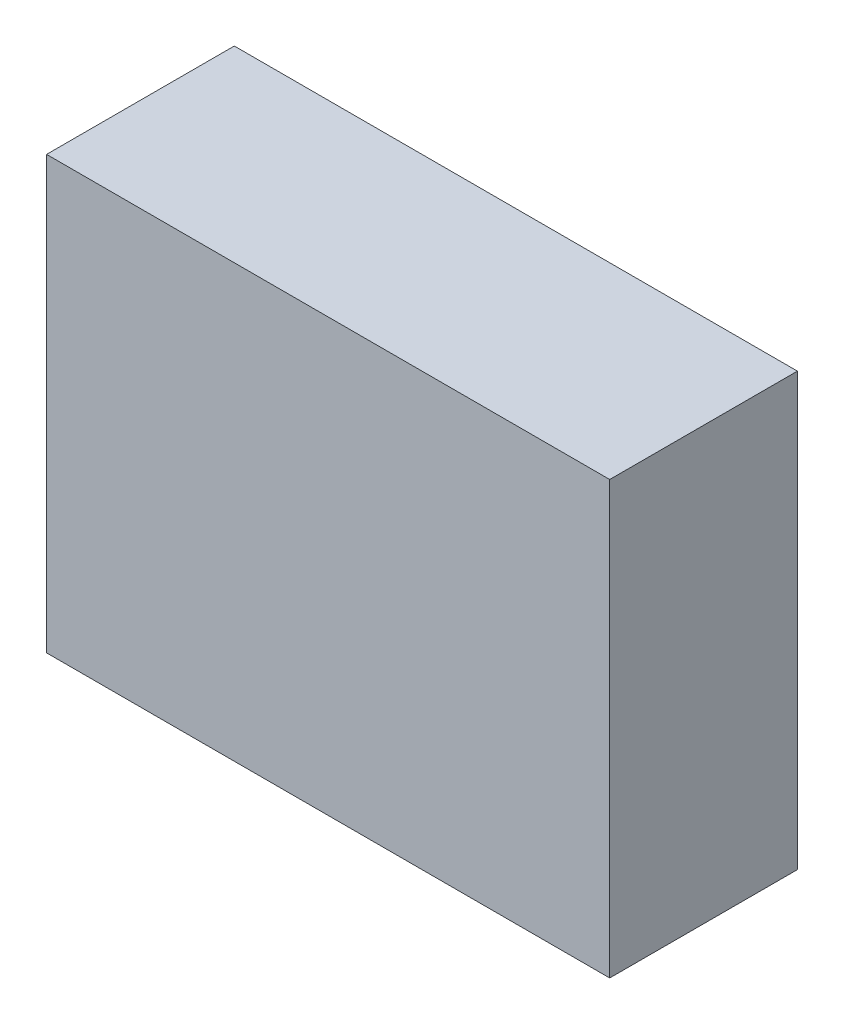
ISO-10303-21;
HEADER;
FILE_DESCRIPTION(('STEP AP214'),'2;1');
FILE_NAME('part.step','',(''),(''),'','','');
FILE_SCHEMA(('AUTOMOTIVE_DESIGN { 1 0 10303 214 1 1 1 1 }'));
ENDSEC;
DATA;
#1=APPLICATION_CONTEXT('core data for automotive mechanical design processes');
#2=APPLICATION_PROTOCOL_DEFINITION('international standard','automotive_design',2000,#1);
#3=PRODUCT_CONTEXT('',#1,'mechanical');
#4=PRODUCT('Part','Part','',(#3));
#5=PRODUCT_RELATED_PRODUCT_CATEGORY('part','',(#4));
#6=PRODUCT_DEFINITION_FORMATION('','',#4);
#7=PRODUCT_DEFINITION_CONTEXT('part definition',#1,'design');
#8=PRODUCT_DEFINITION('design','',#6,#7);
#9=PRODUCT_DEFINITION_SHAPE('','',#8);
#10=(LENGTH_UNIT() NAMED_UNIT(*) SI_UNIT(.MILLI.,.METRE.));
#11=(NAMED_UNIT(*) PLANE_ANGLE_UNIT() SI_UNIT($,.RADIAN.));
#12=(NAMED_UNIT(*) SI_UNIT($,.STERADIAN.) SOLID_ANGLE_UNIT());
#13=UNCERTAINTY_MEASURE_WITH_UNIT(LENGTH_MEASURE(1.E-05),#10,'distance_accuracy_value','');
#14=(GEOMETRIC_REPRESENTATION_CONTEXT(3) GLOBAL_UNCERTAINTY_ASSIGNED_CONTEXT((#13)) GLOBAL_UNIT_ASSIGNED_CONTEXT((#10,
#11,#12)) REPRESENTATION_CONTEXT('',''));
#15=CARTESIAN_POINT('',(0.,0.,0.));
#16=DIRECTION('',(0.,0.,1.));
#17=DIRECTION('',(1.,0.,0.));
#18=AXIS2_PLACEMENT_3D('',#15,#16,#17);
#19=CARTESIAN_POINT('',(-25.,-20.,20.));
#20=DIRECTION('',(1.,0.,0.));
#21=DIRECTION('',(0.,0.,-1.));
#22=AXIS2_PLACEMENT_3D('',#19,#20,#21);
#23=PLANE('',#22);
#24=DIRECTION('',(0.,-1.,0.));
#25=VECTOR('',#24,1.);
#26=CARTESIAN_POINT('',(-25.,-20.,0.));
#27=LINE('',#26,#25);
#28=CARTESIAN_POINT('',(-25.,26.,0.));
#29=VERTEX_POINT('',#28);
#30=CARTESIAN_POINT('',(-25.,-20.,0.));
#31=VERTEX_POINT('',#30);
#32=EDGE_CURVE('E104',#29,#31,#27,.T.);
#33=ORIENTED_EDGE('',*,*,#32,.T.);
#34=DIRECTION('',(0.,0.,-1.));
#35=VECTOR('',#34,1.);
#36=CARTESIAN_POINT('',(-25.,-20.,20.));
#37=LINE('',#36,#35);
#38=CARTESIAN_POINT('',(-25.,-20.,20.));
#39=VERTEX_POINT('',#38);
#40=EDGE_CURVE('E11',#39,#31,#37,.T.);
#41=ORIENTED_EDGE('',*,*,#40,.F.);
#42=DIRECTION('',(0.,-1.,0.));
#43=VECTOR('',#42,1.);
#44=CARTESIAN_POINT('',(-25.,-20.,20.));
#45=LINE('',#44,#43);
#46=CARTESIAN_POINT('',(-25.,26.,20.));
#47=VERTEX_POINT('',#46);
#48=EDGE_CURVE('E92',#47,#39,#45,.T.);
#49=ORIENTED_EDGE('',*,*,#48,.F.);
#50=DIRECTION('',(0.,0.,-1.));
#51=VECTOR('',#50,1.);
#52=CARTESIAN_POINT('',(-25.,26.,20.));
#53=LINE('',#52,#51);
#54=EDGE_CURVE('E100',#47,#29,#53,.T.);
#55=ORIENTED_EDGE('',*,*,#54,.T.);
#56=EDGE_LOOP('',(#33,#41,#49,#55));
#57=FACE_BOUND('',#56,.T.);
#58=ADVANCED_FACE('F41',(#57),#23,.F.);
#59=CARTESIAN_POINT('',(-25.,-20.,20.));
#60=DIRECTION('',(0.,1.,0.));
#61=DIRECTION('',(0.,0.,1.));
#62=AXIS2_PLACEMENT_3D('',#59,#60,#61);
#63=PLANE('',#62);
#64=DIRECTION('',(1.,0.,0.));
#65=VECTOR('',#64,1.);
#66=CARTESIAN_POINT('',(-25.,-20.,0.));
#67=LINE('',#66,#65);
#68=CARTESIAN_POINT('',(35.,-20.,0.));
#69=VERTEX_POINT('',#68);
#70=EDGE_CURVE('E96',#31,#69,#67,.T.);
#71=ORIENTED_EDGE('',*,*,#70,.T.);
#72=DIRECTION('',(0.,0.,-1.));
#73=VECTOR('',#72,1.);
#74=CARTESIAN_POINT('',(35.,-20.,20.));
#75=LINE('',#74,#73);
#76=CARTESIAN_POINT('',(35.,-20.,20.));
#77=VERTEX_POINT('',#76);
#78=EDGE_CURVE('E49',#77,#69,#75,.T.);
#79=ORIENTED_EDGE('',*,*,#78,.F.);
#80=DIRECTION('',(1.,0.,0.));
#81=VECTOR('',#80,1.);
#82=CARTESIAN_POINT('',(-25.,-20.,20.));
#83=LINE('',#82,#81);
#84=EDGE_CURVE('E87',#39,#77,#83,.T.);
#85=ORIENTED_EDGE('',*,*,#84,.F.);
#86=ORIENTED_EDGE('',*,*,#40,.T.);
#87=EDGE_LOOP('',(#71,#79,#85,#86));
#88=FACE_BOUND('',#87,.T.);
#89=ADVANCED_FACE('F95',(#88),#63,.F.);
#90=CARTESIAN_POINT('',(35.,-20.,20.));
#91=DIRECTION('',(-1.,0.,0.));
#92=DIRECTION('',(0.,0.,1.));
#93=AXIS2_PLACEMENT_3D('',#90,#91,#92);
#94=PLANE('',#93);
#95=DIRECTION('',(0.,1.,0.));
#96=VECTOR('',#95,1.);
#97=CARTESIAN_POINT('',(35.,-20.,0.));
#98=LINE('',#97,#96);
#99=CARTESIAN_POINT('',(35.,26.,0.));
#100=VERTEX_POINT('',#99);
#101=EDGE_CURVE('E74',#69,#100,#98,.T.);
#102=ORIENTED_EDGE('',*,*,#101,.T.);
#103=DIRECTION('',(0.,0.,-1.));
#104=VECTOR('',#103,1.);
#105=CARTESIAN_POINT('',(35.,26.,20.));
#106=LINE('',#105,#104);
#107=CARTESIAN_POINT('',(35.,26.,20.));
#108=VERTEX_POINT('',#107);
#109=EDGE_CURVE('E97',#108,#100,#106,.T.);
#110=ORIENTED_EDGE('',*,*,#109,.F.);
#111=DIRECTION('',(0.,1.,0.));
#112=VECTOR('',#111,1.);
#113=CARTESIAN_POINT('',(35.,-20.,20.));
#114=LINE('',#113,#112);
#115=EDGE_CURVE('E90',#77,#108,#114,.T.);
#116=ORIENTED_EDGE('',*,*,#115,.F.);
#117=ORIENTED_EDGE('',*,*,#78,.T.);
#118=EDGE_LOOP('',(#102,#110,#116,#117));
#119=FACE_BOUND('',#118,.T.);
#120=ADVANCED_FACE('F98',(#119),#94,.F.);
#121=CARTESIAN_POINT('',(-25.,26.,20.));
#122=DIRECTION('',(0.,-1.,0.));
#123=DIRECTION('',(0.,0.,-1.));
#124=AXIS2_PLACEMENT_3D('',#121,#122,#123);
#125=PLANE('',#124);
#126=DIRECTION('',(-1.,0.,0.));
#127=VECTOR('',#126,1.);
#128=CARTESIAN_POINT('',(-25.,26.,0.));
#129=LINE('',#128,#127);
#130=EDGE_CURVE('E80',#100,#29,#129,.T.);
#131=ORIENTED_EDGE('',*,*,#130,.T.);
#132=ORIENTED_EDGE('',*,*,#54,.F.);
#133=DIRECTION('',(-1.,0.,0.));
#134=VECTOR('',#133,1.);
#135=CARTESIAN_POINT('',(-25.,26.,20.));
#136=LINE('',#135,#134);
#137=EDGE_CURVE('E57',#108,#47,#136,.T.);
#138=ORIENTED_EDGE('',*,*,#137,.F.);
#139=ORIENTED_EDGE('',*,*,#109,.T.);
#140=EDGE_LOOP('',(#131,#132,#138,#139));
#141=FACE_BOUND('',#140,.T.);
#142=ADVANCED_FACE('F111',(#141),#125,.F.);
#143=CARTESIAN_POINT('',(0.,0.,20.));
#144=DIRECTION('',(0.,0.,-1.));
#145=DIRECTION('',(-1.,0.,0.));
#146=AXIS2_PLACEMENT_3D('',#143,#144,#145);
#147=PLANE('',#146);
#148=ORIENTED_EDGE('',*,*,#48,.T.);
#149=ORIENTED_EDGE('',*,*,#84,.T.);
#150=ORIENTED_EDGE('',*,*,#115,.T.);
#151=ORIENTED_EDGE('',*,*,#137,.T.);
#152=EDGE_LOOP('',(#148,#149,#150,#151));
#153=FACE_BOUND('',#152,.T.);
#154=ADVANCED_FACE('F88',(#153),#147,.F.);
#155=CARTESIAN_POINT('',(0.,0.,0.));
#156=DIRECTION('',(0.,0.,-1.));
#157=DIRECTION('',(-1.,0.,0.));
#158=AXIS2_PLACEMENT_3D('',#155,#156,#157);
#159=PLANE('',#158);
#160=ORIENTED_EDGE('',*,*,#32,.F.);
#161=ORIENTED_EDGE('',*,*,#130,.F.);
#162=ORIENTED_EDGE('',*,*,#101,.F.);
#163=ORIENTED_EDGE('',*,*,#70,.F.);
#164=EDGE_LOOP('',(#160,#161,#162,#163));
#165=FACE_BOUND('',#164,.T.);
#166=ADVANCED_FACE('F114',(#165),#159,.T.);
#167=CLOSED_SHELL('',(#58,#89,#120,#142,#154,#166));
#168=MANIFOLD_SOLID_BREP('B2',#167);
#169=ADVANCED_BREP_SHAPE_REPRESENTATION('',(#18,#168),#14);
#170=SHAPE_DEFINITION_REPRESENTATION(#9,#169);
ENDSEC;
END-ISO-10303-21;
